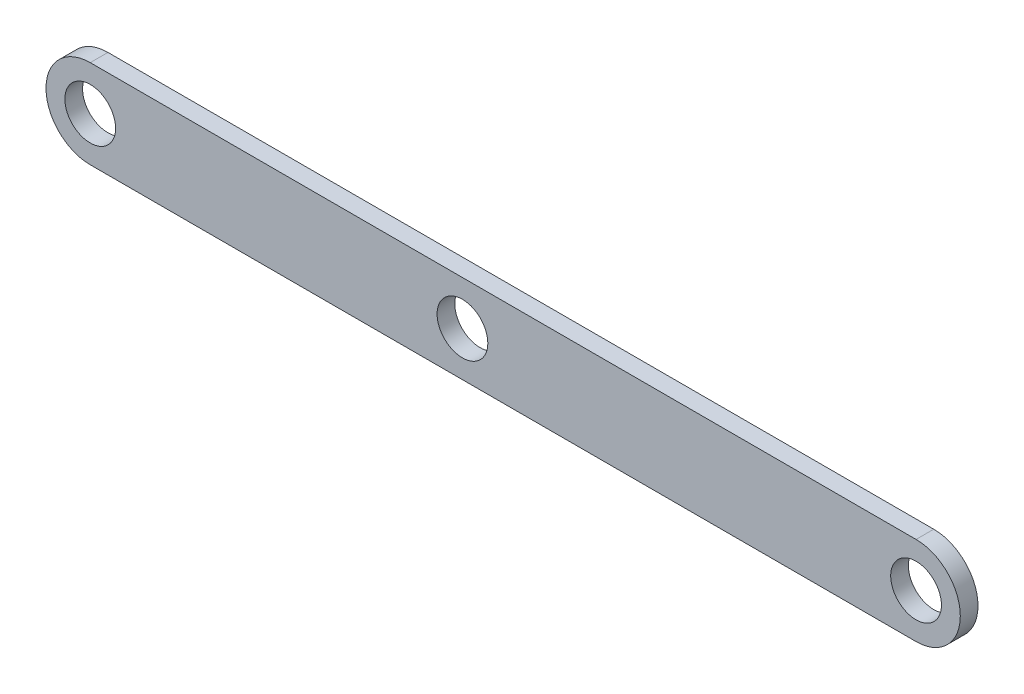
ISO-10303-21;
HEADER;
FILE_DESCRIPTION(('STEP AP214'),'2;1');
FILE_NAME('part.step','',(''),(''),'','','');
FILE_SCHEMA(('AUTOMOTIVE_DESIGN { 1 0 10303 214 1 1 1 1 }'));
ENDSEC;
DATA;
#1=APPLICATION_CONTEXT('core data for automotive mechanical design processes');
#2=APPLICATION_PROTOCOL_DEFINITION('international standard','automotive_design',2000,#1);
#3=PRODUCT_CONTEXT('',#1,'mechanical');
#4=PRODUCT('Part','Part','',(#3));
#5=PRODUCT_RELATED_PRODUCT_CATEGORY('part','',(#4));
#6=PRODUCT_DEFINITION_FORMATION('','',#4);
#7=PRODUCT_DEFINITION_CONTEXT('part definition',#1,'design');
#8=PRODUCT_DEFINITION('design','',#6,#7);
#9=PRODUCT_DEFINITION_SHAPE('','',#8);
#10=(LENGTH_UNIT() NAMED_UNIT(*) SI_UNIT(.MILLI.,.METRE.));
#11=(NAMED_UNIT(*) PLANE_ANGLE_UNIT() SI_UNIT($,.RADIAN.));
#12=(NAMED_UNIT(*) SI_UNIT($,.STERADIAN.) SOLID_ANGLE_UNIT());
#13=UNCERTAINTY_MEASURE_WITH_UNIT(LENGTH_MEASURE(1.E-05),#10,'distance_accuracy_value','');
#14=(GEOMETRIC_REPRESENTATION_CONTEXT(3) GLOBAL_UNCERTAINTY_ASSIGNED_CONTEXT((#13)) GLOBAL_UNIT_ASSIGNED_CONTEXT((#10,
#11,#12)) REPRESENTATION_CONTEXT('',''));
#15=CARTESIAN_POINT('',(0.,0.,0.));
#16=DIRECTION('',(0.,0.,1.));
#17=DIRECTION('',(1.,0.,0.));
#18=AXIS2_PLACEMENT_3D('',#15,#16,#17);
#19=CARTESIAN_POINT('',(0.,0.,3.));
#20=DIRECTION('',(0.,0.,-1.));
#21=DIRECTION('',(-1.,0.,0.));
#22=AXIS2_PLACEMENT_3D('',#19,#20,#21);
#23=CYLINDRICAL_SURFACE('',#22,7.5);
#24=CARTESIAN_POINT('',(0.,0.,0.));
#25=DIRECTION('',(0.,0.,1.));
#26=DIRECTION('',(1.,0.,0.));
#27=AXIS2_PLACEMENT_3D('',#24,#25,#26);
#28=CIRCLE('',#27,7.5);
#29=CARTESIAN_POINT('',(0.,7.5,0.));
#30=VERTEX_POINT('',#29);
#31=CARTESIAN_POINT('',(0.,-7.5,0.));
#32=VERTEX_POINT('',#31);
#33=EDGE_CURVE('E107',#30,#32,#28,.T.);
#34=ORIENTED_EDGE('',*,*,#33,.T.);
#35=DIRECTION('',(0.,0.,-1.));
#36=VECTOR('',#35,1.);
#37=CARTESIAN_POINT('',(0.,-7.5,3.));
#38=LINE('',#37,#36);
#39=CARTESIAN_POINT('',(0.,-7.5,3.));
#40=VERTEX_POINT('',#39);
#41=EDGE_CURVE('E11',#40,#32,#38,.T.);
#42=ORIENTED_EDGE('',*,*,#41,.F.);
#43=CARTESIAN_POINT('',(0.,0.,3.));
#44=DIRECTION('',(0.,0.,1.));
#45=DIRECTION('',(1.,0.,0.));
#46=AXIS2_PLACEMENT_3D('',#43,#44,#45);
#47=CIRCLE('',#46,7.5);
#48=CARTESIAN_POINT('',(0.,7.5,3.));
#49=VERTEX_POINT('',#48);
#50=EDGE_CURVE('E91',#49,#40,#47,.T.);
#51=ORIENTED_EDGE('',*,*,#50,.F.);
#52=DIRECTION('',(0.,0.,-1.));
#53=VECTOR('',#52,1.);
#54=CARTESIAN_POINT('',(0.,7.5,3.));
#55=LINE('',#54,#53);
#56=EDGE_CURVE('E103',#49,#30,#55,.T.);
#57=ORIENTED_EDGE('',*,*,#56,.T.);
#58=EDGE_LOOP('',(#34,#42,#51,#57));
#59=FACE_BOUND('',#58,.T.);
#60=ADVANCED_FACE('F39',(#59),#23,.T.);
#61=CARTESIAN_POINT('',(0.,-7.5,3.));
#62=DIRECTION('',(0.,1.,0.));
#63=DIRECTION('',(0.,0.,1.));
#64=AXIS2_PLACEMENT_3D('',#61,#62,#63);
#65=PLANE('',#64);
#66=DIRECTION('',(1.,0.,0.));
#67=VECTOR('',#66,1.);
#68=CARTESIAN_POINT('',(0.,-7.5,0.));
#69=LINE('',#68,#67);
#70=CARTESIAN_POINT('',(140.,-7.5,0.));
#71=VERTEX_POINT('',#70);
#72=EDGE_CURVE('E96',#32,#71,#69,.T.);
#73=ORIENTED_EDGE('',*,*,#72,.T.);
#74=DIRECTION('',(0.,0.,-1.));
#75=VECTOR('',#74,1.);
#76=CARTESIAN_POINT('',(140.,-7.5,3.));
#77=LINE('',#76,#75);
#78=CARTESIAN_POINT('',(140.,-7.5,3.));
#79=VERTEX_POINT('',#78);
#80=EDGE_CURVE('E48',#79,#71,#77,.T.);
#81=ORIENTED_EDGE('',*,*,#80,.F.);
#82=DIRECTION('',(1.,0.,0.));
#83=VECTOR('',#82,1.);
#84=CARTESIAN_POINT('',(0.,-7.5,3.));
#85=LINE('',#84,#83);
#86=EDGE_CURVE('E86',#40,#79,#85,.T.);
#87=ORIENTED_EDGE('',*,*,#86,.F.);
#88=ORIENTED_EDGE('',*,*,#41,.T.);
#89=EDGE_LOOP('',(#73,#81,#87,#88));
#90=FACE_BOUND('',#89,.T.);
#91=ADVANCED_FACE('F95',(#90),#65,.F.);
#92=CARTESIAN_POINT('',(140.,0.,3.));
#93=DIRECTION('',(0.,0.,-1.));
#94=DIRECTION('',(-1.,0.,0.));
#95=AXIS2_PLACEMENT_3D('',#92,#93,#94);
#96=CYLINDRICAL_SURFACE('',#95,7.5);
#97=CARTESIAN_POINT('',(140.,0.,0.));
#98=DIRECTION('',(0.,0.,1.));
#99=DIRECTION('',(1.,0.,0.));
#100=AXIS2_PLACEMENT_3D('',#97,#98,#99);
#101=CIRCLE('',#100,7.5);
#102=CARTESIAN_POINT('',(140.,7.5,0.));
#103=VERTEX_POINT('',#102);
#104=EDGE_CURVE('E73',#71,#103,#101,.T.);
#105=ORIENTED_EDGE('',*,*,#104,.T.);
#106=DIRECTION('',(0.,0.,-1.));
#107=VECTOR('',#106,1.);
#108=CARTESIAN_POINT('',(140.,7.5,3.));
#109=LINE('',#108,#107);
#110=CARTESIAN_POINT('',(140.,7.5,3.));
#111=VERTEX_POINT('',#110);
#112=EDGE_CURVE('E98',#111,#103,#109,.T.);
#113=ORIENTED_EDGE('',*,*,#112,.F.);
#114=CARTESIAN_POINT('',(140.,0.,3.));
#115=DIRECTION('',(0.,0.,1.));
#116=DIRECTION('',(1.,0.,0.));
#117=AXIS2_PLACEMENT_3D('',#114,#115,#116);
#118=CIRCLE('',#117,7.5);
#119=EDGE_CURVE('E89',#79,#111,#118,.T.);
#120=ORIENTED_EDGE('',*,*,#119,.F.);
#121=ORIENTED_EDGE('',*,*,#80,.T.);
#122=EDGE_LOOP('',(#105,#113,#120,#121));
#123=FACE_BOUND('',#122,.T.);
#124=ADVANCED_FACE('F99',(#123),#96,.T.);
#125=CARTESIAN_POINT('',(0.,7.5,3.));
#126=DIRECTION('',(0.,-1.,0.));
#127=DIRECTION('',(0.,0.,-1.));
#128=AXIS2_PLACEMENT_3D('',#125,#126,#127);
#129=PLANE('',#128);
#130=DIRECTION('',(-1.,0.,0.));
#131=VECTOR('',#130,1.);
#132=CARTESIAN_POINT('',(0.,7.5,0.));
#133=LINE('',#132,#131);
#134=EDGE_CURVE('E79',#103,#30,#133,.T.);
#135=ORIENTED_EDGE('',*,*,#134,.T.);
#136=ORIENTED_EDGE('',*,*,#56,.F.);
#137=DIRECTION('',(-1.,0.,0.));
#138=VECTOR('',#137,1.);
#139=CARTESIAN_POINT('',(0.,7.5,3.));
#140=LINE('',#139,#138);
#141=EDGE_CURVE('E56',#111,#49,#140,.T.);
#142=ORIENTED_EDGE('',*,*,#141,.F.);
#143=ORIENTED_EDGE('',*,*,#112,.T.);
#144=EDGE_LOOP('',(#135,#136,#142,#143));
#145=FACE_BOUND('',#144,.T.);
#146=ADVANCED_FACE('F121',(#145),#129,.F.);
#147=CARTESIAN_POINT('',(0.,0.,3.));
#148=DIRECTION('',(0.,0.,1.));
#149=DIRECTION('',(1.,0.,0.));
#150=AXIS2_PLACEMENT_3D('',#147,#148,#149);
#151=PLANE('',#150);
#152=CARTESIAN_POINT('',(0.,0.,3.));
#153=DIRECTION('',(0.,0.,1.));
#154=DIRECTION('',(1.,0.,0.));
#155=AXIS2_PLACEMENT_3D('',#152,#153,#154);
#156=CIRCLE('',#155,4.3);
#157=CARTESIAN_POINT('',(4.3,0.,3.));
#158=VERTEX_POINT('',#157);
#159=EDGE_CURVE('E144',#158,#158,#156,.T.);
#160=ORIENTED_EDGE('',*,*,#159,.F.);
#161=EDGE_LOOP('',(#160));
#162=FACE_BOUND('',#161,.T.);
#163=CARTESIAN_POINT('',(140.,0.,3.));
#164=DIRECTION('',(0.,0.,1.));
#165=DIRECTION('',(1.,0.,0.));
#166=AXIS2_PLACEMENT_3D('',#163,#164,#165);
#167=CIRCLE('',#166,4.3);
#168=CARTESIAN_POINT('',(144.3,0.,3.));
#169=VERTEX_POINT('',#168);
#170=EDGE_CURVE('E136',#169,#169,#167,.T.);
#171=ORIENTED_EDGE('',*,*,#170,.F.);
#172=EDGE_LOOP('',(#171));
#173=FACE_BOUND('',#172,.T.);
#174=CARTESIAN_POINT('',(63.1,0.,3.));
#175=DIRECTION('',(0.,0.,1.));
#176=DIRECTION('',(1.,0.,0.));
#177=AXIS2_PLACEMENT_3D('',#174,#175,#176);
#178=CIRCLE('',#177,4.3);
#179=CARTESIAN_POINT('',(67.4,0.,3.));
#180=VERTEX_POINT('',#179);
#181=EDGE_CURVE('E128',#180,#180,#178,.T.);
#182=ORIENTED_EDGE('',*,*,#181,.F.);
#183=EDGE_LOOP('',(#182));
#184=FACE_BOUND('',#183,.T.);
#185=ORIENTED_EDGE('',*,*,#50,.T.);
#186=ORIENTED_EDGE('',*,*,#86,.T.);
#187=ORIENTED_EDGE('',*,*,#119,.T.);
#188=ORIENTED_EDGE('',*,*,#141,.T.);
#189=EDGE_LOOP('',(#185,#186,#187,#188));
#190=FACE_BOUND('',#189,.T.);
#191=ADVANCED_FACE('F87',(#162,#173,#184,#190),#151,.T.);
#192=CARTESIAN_POINT('',(0.,0.,0.));
#193=DIRECTION('',(0.,0.,1.));
#194=DIRECTION('',(1.,0.,0.));
#195=AXIS2_PLACEMENT_3D('',#192,#193,#194);
#196=PLANE('',#195);
#197=CARTESIAN_POINT('',(0.,0.,0.));
#198=DIRECTION('',(0.,0.,1.));
#199=DIRECTION('',(1.,0.,0.));
#200=AXIS2_PLACEMENT_3D('',#197,#198,#199);
#201=CIRCLE('',#200,4.3);
#202=CARTESIAN_POINT('',(4.3,0.,0.));
#203=VERTEX_POINT('',#202);
#204=EDGE_CURVE('E111',#203,#203,#201,.T.);
#205=ORIENTED_EDGE('',*,*,#204,.T.);
#206=EDGE_LOOP('',(#205));
#207=FACE_BOUND('',#206,.T.);
#208=CARTESIAN_POINT('',(140.,0.,0.));
#209=DIRECTION('',(0.,0.,1.));
#210=DIRECTION('',(1.,0.,0.));
#211=AXIS2_PLACEMENT_3D('',#208,#209,#210);
#212=CIRCLE('',#211,4.3);
#213=CARTESIAN_POINT('',(144.3,0.,0.));
#214=VERTEX_POINT('',#213);
#215=EDGE_CURVE('E140',#214,#214,#212,.T.);
#216=ORIENTED_EDGE('',*,*,#215,.T.);
#217=EDGE_LOOP('',(#216));
#218=FACE_BOUND('',#217,.T.);
#219=CARTESIAN_POINT('',(63.1,0.,0.));
#220=DIRECTION('',(0.,0.,1.));
#221=DIRECTION('',(1.,0.,0.));
#222=AXIS2_PLACEMENT_3D('',#219,#220,#221);
#223=CIRCLE('',#222,4.3);
#224=CARTESIAN_POINT('',(67.4,0.,0.));
#225=VERTEX_POINT('',#224);
#226=EDGE_CURVE('E132',#225,#225,#223,.T.);
#227=ORIENTED_EDGE('',*,*,#226,.T.);
#228=EDGE_LOOP('',(#227));
#229=FACE_BOUND('',#228,.T.);
#230=ORIENTED_EDGE('',*,*,#33,.F.);
#231=ORIENTED_EDGE('',*,*,#134,.F.);
#232=ORIENTED_EDGE('',*,*,#104,.F.);
#233=ORIENTED_EDGE('',*,*,#72,.F.);
#234=EDGE_LOOP('',(#230,#231,#232,#233));
#235=FACE_BOUND('',#234,.T.);
#236=ADVANCED_FACE('F124',(#207,#218,#229,#235),#196,.F.);
#237=CARTESIAN_POINT('',(63.1,0.,0.));
#238=DIRECTION('',(0.,0.,1.));
#239=DIRECTION('',(1.,0.,0.));
#240=AXIS2_PLACEMENT_3D('',#237,#238,#239);
#241=CYLINDRICAL_SURFACE('',#240,4.3);
#242=ORIENTED_EDGE('',*,*,#226,.F.);
#243=EDGE_LOOP('',(#242));
#244=FACE_BOUND('',#243,.T.);
#245=ORIENTED_EDGE('',*,*,#181,.T.);
#246=EDGE_LOOP('',(#245));
#247=FACE_BOUND('',#246,.T.);
#248=ADVANCED_FACE('F168',(#244,#247),#241,.F.);
#249=CARTESIAN_POINT('',(140.,0.,0.));
#250=DIRECTION('',(0.,0.,1.));
#251=DIRECTION('',(1.,0.,0.));
#252=AXIS2_PLACEMENT_3D('',#249,#250,#251);
#253=CYLINDRICAL_SURFACE('',#252,4.3);
#254=ORIENTED_EDGE('',*,*,#215,.F.);
#255=EDGE_LOOP('',(#254));
#256=FACE_BOUND('',#255,.T.);
#257=ORIENTED_EDGE('',*,*,#170,.T.);
#258=EDGE_LOOP('',(#257));
#259=FACE_BOUND('',#258,.T.);
#260=ADVANCED_FACE('F157',(#256,#259),#253,.F.);
#261=CARTESIAN_POINT('',(0.,0.,0.));
#262=DIRECTION('',(0.,0.,1.));
#263=DIRECTION('',(1.,0.,0.));
#264=AXIS2_PLACEMENT_3D('',#261,#262,#263);
#265=CYLINDRICAL_SURFACE('',#264,4.3);
#266=ORIENTED_EDGE('',*,*,#204,.F.);
#267=EDGE_LOOP('',(#266));
#268=FACE_BOUND('',#267,.T.);
#269=ORIENTED_EDGE('',*,*,#159,.T.);
#270=EDGE_LOOP('',(#269));
#271=FACE_BOUND('',#270,.T.);
#272=ADVANCED_FACE('F154',(#268,#271),#265,.F.);
#273=CLOSED_SHELL('',(#60,#91,#124,#146,#191,#236,#248,#260,#272));
#274=MANIFOLD_SOLID_BREP('B2',#273);
#275=ADVANCED_BREP_SHAPE_REPRESENTATION('',(#18,#274),#14);
#276=SHAPE_DEFINITION_REPRESENTATION(#9,#275);
ENDSEC;
END-ISO-10303-21;
